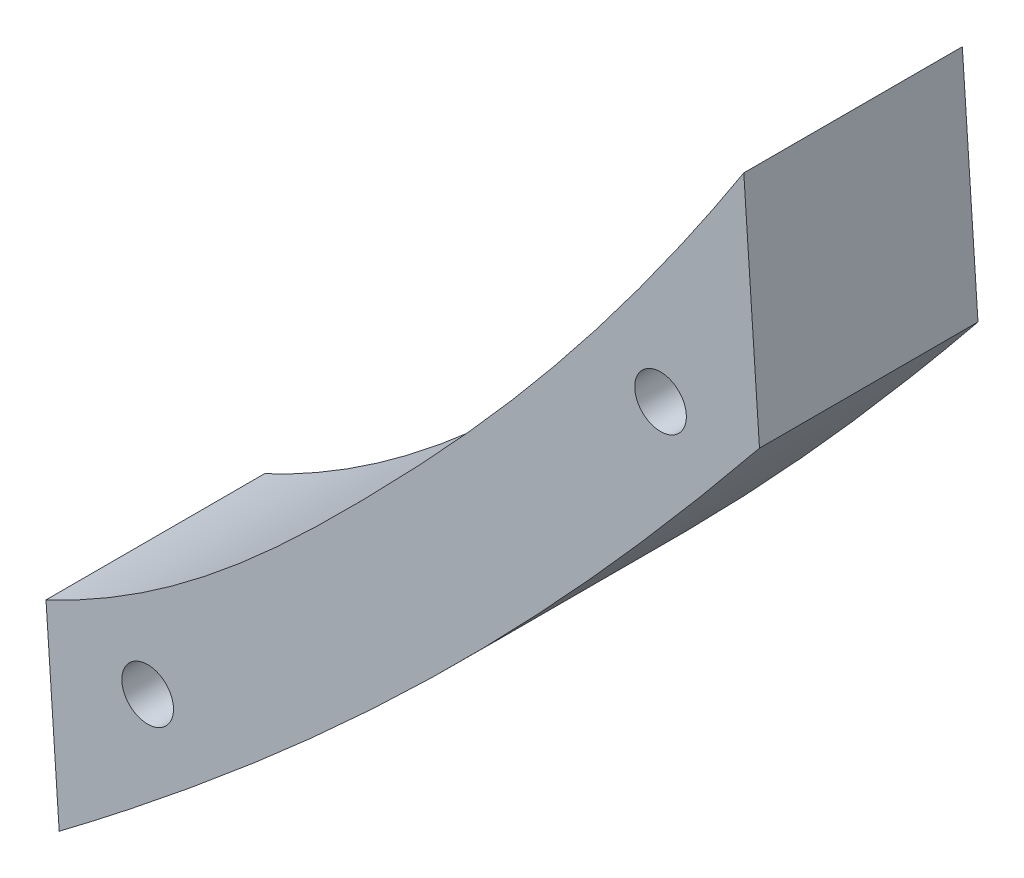
ISO-10303-21;
HEADER;
FILE_DESCRIPTION(('STEP AP214'),'2;1');
FILE_NAME('part.step','',(''),(''),'','','');
FILE_SCHEMA(('AUTOMOTIVE_DESIGN { 1 0 10303 214 1 1 1 1 }'));
ENDSEC;
DATA;
#1=APPLICATION_CONTEXT('core data for automotive mechanical design processes');
#2=APPLICATION_PROTOCOL_DEFINITION('international standard','automotive_design',2000,#1);
#3=PRODUCT_CONTEXT('',#1,'mechanical');
#4=PRODUCT('Part','Part','',(#3));
#5=PRODUCT_RELATED_PRODUCT_CATEGORY('part','',(#4));
#6=PRODUCT_DEFINITION_FORMATION('','',#4);
#7=PRODUCT_DEFINITION_CONTEXT('part definition',#1,'design');
#8=PRODUCT_DEFINITION('design','',#6,#7);
#9=PRODUCT_DEFINITION_SHAPE('','',#8);
#10=(LENGTH_UNIT() NAMED_UNIT(*) SI_UNIT(.MILLI.,.METRE.));
#11=(NAMED_UNIT(*) PLANE_ANGLE_UNIT() SI_UNIT($,.RADIAN.));
#12=(NAMED_UNIT(*) SI_UNIT($,.STERADIAN.) SOLID_ANGLE_UNIT());
#13=UNCERTAINTY_MEASURE_WITH_UNIT(LENGTH_MEASURE(1.E-05),#10,'distance_accuracy_value','');
#14=(GEOMETRIC_REPRESENTATION_CONTEXT(3) GLOBAL_UNCERTAINTY_ASSIGNED_CONTEXT((#13)) GLOBAL_UNIT_ASSIGNED_CONTEXT((#10,
#11,#12)) REPRESENTATION_CONTEXT('',''));
#15=CARTESIAN_POINT('',(0.,0.,0.));
#16=DIRECTION('',(0.,0.,1.));
#17=DIRECTION('',(1.,0.,0.));
#18=AXIS2_PLACEMENT_3D('',#15,#16,#17);
#19=CARTESIAN_POINT('',(25.2640248175677,1.7189432963557,22.));
#20=DIRECTION('',(0.99769334125609,0.0678822275213385,0.));
#21=DIRECTION('',(-0.0678822275213385,0.99769334125609,0.));
#22=AXIS2_PLACEMENT_3D('',#19,#20,#21);
#23=PLANE('',#22);
#24=DIRECTION('',(0.0678822275213385,-0.99769334125609,0.));
#25=VECTOR('',#24,1.);
#26=CARTESIAN_POINT('',(25.2640248175677,1.7189432963557,0.));
#27=LINE('',#26,#25);
#28=CARTESIAN_POINT('',(23.8473409387099,22.5405356955889,0.));
#29=VERTEX_POINT('',#28);
#30=CARTESIAN_POINT('',(25.4265953780617,-0.670423871038782,0.));
#31=VERTEX_POINT('',#30);
#32=EDGE_CURVE('E201',#29,#31,#27,.T.);
#33=ORIENTED_EDGE('',*,*,#32,.F.);
#34=DIRECTION('',(0.,0.,-1.));
#35=VECTOR('',#34,1.);
#36=CARTESIAN_POINT('',(23.8473409387099,22.5405356955889,22.));
#37=LINE('',#36,#35);
#38=CARTESIAN_POINT('',(23.8473409387099,22.5405356955889,22.));
#39=VERTEX_POINT('',#38);
#40=EDGE_CURVE('E11',#39,#29,#37,.T.);
#41=ORIENTED_EDGE('',*,*,#40,.F.);
#42=DIRECTION('',(0.0678822275213385,-0.99769334125609,0.));
#43=VECTOR('',#42,1.);
#44=CARTESIAN_POINT('',(25.2640248175677,1.7189432963557,22.));
#45=LINE('',#44,#43);
#46=CARTESIAN_POINT('',(25.4265953780617,-0.670423871038782,22.));
#47=VERTEX_POINT('',#46);
#48=EDGE_CURVE('E111',#39,#47,#45,.T.);
#49=ORIENTED_EDGE('',*,*,#48,.T.);
#50=DIRECTION('',(0.,0.,-1.));
#51=VECTOR('',#50,1.);
#52=CARTESIAN_POINT('',(25.4265953780617,-0.670423871038782,22.));
#53=LINE('',#52,#51);
#54=EDGE_CURVE('E91',#47,#31,#53,.T.);
#55=ORIENTED_EDGE('',*,*,#54,.T.);
#56=EDGE_LOOP('',(#33,#41,#49,#55));
#57=FACE_BOUND('',#56,.T.);
#58=ADVANCED_FACE('F45',(#57),#23,.T.);
#59=CARTESIAN_POINT('',(23.8473409387099,22.5405356955889,22.));
#60=CARTESIAN_POINT('',(23.6491535304646,22.2332919819376,22.));
#61=CARTESIAN_POINT('',(23.4504855713976,21.9263568846529,22.));
#62=CARTESIAN_POINT('',(19.3021932377396,15.5395771900557,22.));
#63=CARTESIAN_POINT('',(15.1597025894018,9.58517610056214,22.));
#64=CARTESIAN_POINT('',(8.59675494574103,0.91529588340617,22.));
#65=CARTESIAN_POINT('',(6.35133789966357,-1.93124749239646,22.));
#66=CARTESIAN_POINT('',(1.74462724827758,-7.52826665116865,22.));
#67=CARTESIAN_POINT('',(-0.617237974392294,-10.2791378985868,22.));
#68=CARTESIAN_POINT('',(-5.44585246443262,-15.6858887260502,22.));
#69=CARTESIAN_POINT('',(-7.91319599352471,-18.3424702154184,22.));
#70=CARTESIAN_POINT('',(-11.6749588076315,-22.2679797221105,22.));
#71=CARTESIAN_POINT('',(-12.9389825872912,-23.5670735030108,22.));
#72=CARTESIAN_POINT('',(-15.4831035950763,-26.1491048737287,22.));
#73=CARTESIAN_POINT('',(-16.7624451532667,-27.4327600415091,22.));
#74=CARTESIAN_POINT('',(-20.6400219649403,-31.2437417473805,22.));
#75=CARTESIAN_POINT('',(-23.2785774509376,-33.7322264411462,22.));
#76=CARTESIAN_POINT('',(-28.7493487435284,-38.4912441648454,22.));
#77=CARTESIAN_POINT('',(-31.5819329797457,-40.7614767858578,22.));
#78=CARTESIAN_POINT('',(-37.5021552599386,-44.94807953671,22.));
#79=CARTESIAN_POINT('',(-40.5908011413323,-46.8630063146389,22.));
#80=CARTESIAN_POINT('',(-44.6645701900234,-48.977283832471,22.));
#81=CARTESIAN_POINT('',(-45.5296321195015,-49.4039996667277,22.));
#82=CARTESIAN_POINT('',(-46.4032182060406,-49.8124954453141,22.));
#83=B_SPLINE_CURVE_WITH_KNOTS('',3,(#59,#60,#61,#62,#63,#64,#65,#66,#67,#68,#69,#70,#71,#72,#73,
#74,#75,#76,#77,#78,#79,#80,#81,#82),.UNSPECIFIED.,.F.,.F.,(4,2,2,2,2,2,2,2,2,2,2,4),
(0.243696274232532,0.25,0.375,0.4375,0.5,0.5625,0.59375,0.625,0.6875,0.75,0.8125,
0.829122532866038),.UNSPECIFIED.);
#84=DIRECTION('',(0.,0.,-1.));
#85=VECTOR('',#84,1.);
#86=SURFACE_OF_LINEAR_EXTRUSION('',#83,#85);
#87=CARTESIAN_POINT('',(23.8473409387099,22.5405356955889,0.));
#88=CARTESIAN_POINT('',(23.6491535304646,22.2332919819376,0.));
#89=CARTESIAN_POINT('',(23.4504855713976,21.9263568846529,0.));
#90=CARTESIAN_POINT('',(19.3021932377396,15.5395771900557,0.));
#91=CARTESIAN_POINT('',(15.1597025894018,9.58517610056214,0.));
#92=CARTESIAN_POINT('',(8.59675494574103,0.91529588340617,0.));
#93=CARTESIAN_POINT('',(6.35133789966357,-1.93124749239646,0.));
#94=CARTESIAN_POINT('',(1.74462724827758,-7.52826665116865,0.));
#95=CARTESIAN_POINT('',(-0.617237974392294,-10.2791378985868,0.));
#96=CARTESIAN_POINT('',(-5.44585246443262,-15.6858887260502,0.));
#97=CARTESIAN_POINT('',(-7.91319599352471,-18.3424702154184,0.));
#98=CARTESIAN_POINT('',(-11.6749588076315,-22.2679797221105,0.));
#99=CARTESIAN_POINT('',(-12.9389825872912,-23.5670735030108,0.));
#100=CARTESIAN_POINT('',(-15.4831035950763,-26.1491048737287,0.));
#101=CARTESIAN_POINT('',(-16.7624451532667,-27.4327600415091,0.));
#102=CARTESIAN_POINT('',(-20.6400219649403,-31.2437417473805,0.));
#103=CARTESIAN_POINT('',(-23.2785774509376,-33.7322264411462,0.));
#104=CARTESIAN_POINT('',(-28.7493487435284,-38.4912441648454,0.));
#105=CARTESIAN_POINT('',(-31.5819329797457,-40.7614767858578,0.));
#106=CARTESIAN_POINT('',(-37.5021552599386,-44.94807953671,0.));
#107=CARTESIAN_POINT('',(-40.5908011413323,-46.8630063146389,0.));
#108=CARTESIAN_POINT('',(-44.6645701900234,-48.977283832471,0.));
#109=CARTESIAN_POINT('',(-45.5296321195015,-49.4039996667277,0.));
#110=CARTESIAN_POINT('',(-46.4032182060406,-49.8124954453141,0.));
#111=B_SPLINE_CURVE_WITH_KNOTS('',3,(#87,#88,#89,#90,#91,#92,#93,#94,#95,#96,#97,#98,#99,#100,
#101,#102,#103,#104,#105,#106,#107,#108,#109,#110),.UNSPECIFIED.,.F.,.F.,(4,2,2,2,2,2,2,2,2,2,2,
4),(0.243696274232532,0.25,0.375,0.4375,0.5,0.5625,0.59375,0.625,0.6875,0.75,0.8125,
0.829122532866038),.UNSPECIFIED.);
#112=CARTESIAN_POINT('',(-46.4032182060407,-49.8124954453141,0.));
#113=VERTEX_POINT('',#112);
#114=EDGE_CURVE('E119',#29,#113,#111,.T.);
#115=ORIENTED_EDGE('',*,*,#114,.T.);
#116=DIRECTION('',(0.,0.,-1.));
#117=VECTOR('',#116,1.);
#118=CARTESIAN_POINT('',(-46.4032182060407,-49.8124954453141,22.));
#119=LINE('',#118,#117);
#120=CARTESIAN_POINT('',(-46.4032182060407,-49.8124954453141,22.));
#121=VERTEX_POINT('',#120);
#122=EDGE_CURVE('E58',#121,#113,#119,.T.);
#123=ORIENTED_EDGE('',*,*,#122,.F.);
#124=CARTESIAN_POINT('',(-46.4032182060406,-49.8124954453141,22.));
#125=CARTESIAN_POINT('',(-45.5296321195015,-49.4039996667277,22.));
#126=CARTESIAN_POINT('',(-44.6645701900234,-48.977283832471,22.));
#127=CARTESIAN_POINT('',(-40.5908011413323,-46.8630063146389,22.));
#128=CARTESIAN_POINT('',(-37.5021552599386,-44.94807953671,22.));
#129=CARTESIAN_POINT('',(-31.5819329797457,-40.7614767858578,22.));
#130=CARTESIAN_POINT('',(-28.7493487435284,-38.4912441648454,22.));
#131=CARTESIAN_POINT('',(-23.2785774509376,-33.7322264411462,22.));
#132=CARTESIAN_POINT('',(-20.6400219649403,-31.2437417473805,22.));
#133=CARTESIAN_POINT('',(-16.7624451532667,-27.4327600415091,22.));
#134=CARTESIAN_POINT('',(-15.4831035950763,-26.1491048737287,22.));
#135=CARTESIAN_POINT('',(-12.9389825872912,-23.5670735030108,22.));
#136=CARTESIAN_POINT('',(-11.6749588076315,-22.2679797221105,22.));
#137=CARTESIAN_POINT('',(-7.91319599352471,-18.3424702154184,22.));
#138=CARTESIAN_POINT('',(-5.44585246443262,-15.6858887260502,22.));
#139=CARTESIAN_POINT('',(-0.617237974392294,-10.2791378985868,22.));
#140=CARTESIAN_POINT('',(1.74462724827758,-7.52826665116865,22.));
#141=CARTESIAN_POINT('',(6.35133789966357,-1.93124749239646,22.));
#142=CARTESIAN_POINT('',(8.59675494574103,0.91529588340617,22.));
#143=CARTESIAN_POINT('',(15.1597025894018,9.58517610056214,22.));
#144=CARTESIAN_POINT('',(19.3021932377396,15.5395771900557,22.));
#145=CARTESIAN_POINT('',(23.4504855713976,21.9263568846529,22.));
#146=CARTESIAN_POINT('',(23.6491535304646,22.2332919819376,22.));
#147=CARTESIAN_POINT('',(23.8473409387099,22.5405356955889,22.));
#148=B_SPLINE_CURVE_WITH_KNOTS('',3,(#124,#125,#126,#127,#128,#129,#130,#131,#132,#133,#134,
#135,#136,#137,#138,#139,#140,#141,#142,#143,#144,#145,#146,#147),.UNSPECIFIED.,.F.,.F.,(4,2,2,
2,2,2,2,2,2,2,2,4),(0.243696274232532,0.26031880709857,0.32281880709857,0.38531880709857,
0.44781880709857,0.47906880709857,0.51031880709857,0.57281880709857,0.63531880709857,
0.69781880709857,0.82281880709857,0.829122532866038),.UNSPECIFIED.);
#149=EDGE_CURVE('E107',#39,#121,#148,.F.);
#150=ORIENTED_EDGE('',*,*,#149,.F.);
#151=ORIENTED_EDGE('',*,*,#40,.T.);
#152=EDGE_LOOP('',(#115,#123,#150,#151));
#153=FACE_BOUND('',#152,.T.);
#154=ADVANCED_FACE('F117',(#153),#86,.F.);
#155=CARTESIAN_POINT('',(-49.5629757766391,-3.37222376774472,22.));
#156=DIRECTION('',(0.99769334125609,0.0678822275213391,0.));
#157=DIRECTION('',(-0.0678822275213391,0.99769334125609,0.));
#158=AXIS2_PLACEMENT_3D('',#155,#156,#157);
#159=PLANE('',#158);
#160=DIRECTION('',(0.0678822275213391,-0.99769334125609,0.));
#161=VECTOR('',#160,1.);
#162=CARTESIAN_POINT('',(-49.5629757766391,-3.37222376774472,0.));
#163=LINE('',#162,#161);
#164=CARTESIAN_POINT('',(-45.0755582048845,-69.3256668743038,0.));
#165=VERTEX_POINT('',#164);
#166=EDGE_CURVE('E191',#113,#165,#163,.T.);
#167=ORIENTED_EDGE('',*,*,#166,.T.);
#168=DIRECTION('',(0.,0.,-1.));
#169=VECTOR('',#168,1.);
#170=CARTESIAN_POINT('',(-45.0755582048845,-69.3256668743038,22.));
#171=LINE('',#170,#169);
#172=CARTESIAN_POINT('',(-45.0755582048845,-69.3256668743038,22.));
#173=VERTEX_POINT('',#172);
#174=EDGE_CURVE('E105',#173,#165,#171,.T.);
#175=ORIENTED_EDGE('',*,*,#174,.F.);
#176=DIRECTION('',(0.0678822275213391,-0.99769334125609,0.));
#177=VECTOR('',#176,1.);
#178=CARTESIAN_POINT('',(-49.5629757766391,-3.37222376774472,22.));
#179=LINE('',#178,#177);
#180=EDGE_CURVE('E99',#121,#173,#179,.T.);
#181=ORIENTED_EDGE('',*,*,#180,.F.);
#182=ORIENTED_EDGE('',*,*,#122,.T.);
#183=EDGE_LOOP('',(#167,#175,#181,#182));
#184=FACE_BOUND('',#183,.T.);
#185=ADVANCED_FACE('F102',(#184),#159,.F.);
#186=CARTESIAN_POINT('',(15.4665953780617,-1.598123556049,22.));
#187=DIRECTION('',(0.,0.,-1.));
#188=DIRECTION('',(-1.,0.,0.));
#189=AXIS2_PLACEMENT_3D('',#186,#187,#188);
#190=CYLINDRICAL_SURFACE('',#189,2.6);
#191=CARTESIAN_POINT('',(15.4665953780617,-1.598123556049,22.));
#192=DIRECTION('',(0.,0.,1.));
#193=DIRECTION('',(1.,0.,0.));
#194=AXIS2_PLACEMENT_3D('',#191,#192,#193);
#195=CIRCLE('',#194,2.6);
#196=CARTESIAN_POINT('',(18.0665953780617,-1.598123556049,22.));
#197=VERTEX_POINT('',#196);
#198=EDGE_CURVE('E151',#197,#197,#195,.T.);
#199=ORIENTED_EDGE('',*,*,#198,.T.);
#200=EDGE_LOOP('',(#199));
#201=FACE_BOUND('',#200,.T.);
#202=CARTESIAN_POINT('',(15.4665953780617,-1.598123556049,0.));
#203=DIRECTION('',(0.,0.,1.));
#204=DIRECTION('',(1.,0.,0.));
#205=AXIS2_PLACEMENT_3D('',#202,#203,#204);
#206=CIRCLE('',#205,2.6);
#207=CARTESIAN_POINT('',(18.0665953780617,-1.598123556049,0.));
#208=VERTEX_POINT('',#207);
#209=EDGE_CURVE('E203',#208,#208,#206,.T.);
#210=ORIENTED_EDGE('',*,*,#209,.F.);
#211=EDGE_LOOP('',(#210));
#212=FACE_BOUND('',#211,.T.);
#213=ADVANCED_FACE('F257',(#201,#212),#190,.F.);
#214=CARTESIAN_POINT('',(-36.1678861212229,-52.9314659667362,22.));
#215=DIRECTION('',(0.,0.,-1.));
#216=DIRECTION('',(-1.,0.,0.));
#217=AXIS2_PLACEMENT_3D('',#214,#215,#216);
#218=CYLINDRICAL_SURFACE('',#217,2.59999999986289);
#219=CARTESIAN_POINT('',(-36.1678861212229,-52.9314659667362,22.));
#220=DIRECTION('',(0.,0.,1.));
#221=DIRECTION('',(1.,0.,0.));
#222=AXIS2_PLACEMENT_3D('',#219,#220,#221);
#223=CIRCLE('',#222,2.59999999986289);
#224=CARTESIAN_POINT('',(-33.56788612136,-52.9314659667362,22.));
#225=VERTEX_POINT('',#224);
#226=EDGE_CURVE('E315',#225,#225,#223,.T.);
#227=ORIENTED_EDGE('',*,*,#226,.T.);
#228=EDGE_LOOP('',(#227));
#229=FACE_BOUND('',#228,.T.);
#230=CARTESIAN_POINT('',(-36.1678861212229,-52.9314659667362,0.));
#231=DIRECTION('',(0.,0.,1.));
#232=DIRECTION('',(1.,0.,0.));
#233=AXIS2_PLACEMENT_3D('',#230,#231,#232);
#234=CIRCLE('',#233,2.59999999986289);
#235=CARTESIAN_POINT('',(-33.56788612136,-52.9314659667362,0.));
#236=VERTEX_POINT('',#235);
#237=EDGE_CURVE('E160',#236,#236,#234,.T.);
#238=ORIENTED_EDGE('',*,*,#237,.F.);
#239=EDGE_LOOP('',(#238));
#240=FACE_BOUND('',#239,.T.);
#241=ADVANCED_FACE('F47',(#229,#240),#218,.F.);
#242=CARTESIAN_POINT('',(-45.0755582048845,-69.3256668743038,22.));
#243=CARTESIAN_POINT('',(-42.7543088320265,-67.5744162126505,22.));
#244=CARTESIAN_POINT('',(-40.4516692821754,-65.7985125405873,22.));
#245=CARTESIAN_POINT('',(-32.2943092341557,-59.3684686151079,22.));
#246=CARTESIAN_POINT('',(-26.5461000074045,-54.5782551081632,22.));
#247=CARTESIAN_POINT('',(-15.3451361817294,-44.6640211170277,22.));
#248=CARTESIAN_POINT('',(-9.89564699636274,-39.5366024868595,22.));
#249=CARTESIAN_POINT('',(0.681335287035538,-28.9590933895541,22.));
#250=CARTESIAN_POINT('',(5.80823644696768,-23.5095754280478,22.));
#251=CARTESIAN_POINT('',(15.7635037092364,-12.3443688121849,22.));
#252=CARTESIAN_POINT('',(20.5923466292677,-6.63073098368548,22.));
#253=CARTESIAN_POINT('',(25.3447026662408,-0.771444988781816,22.));
#254=CARTESIAN_POINT('',(25.3856534133577,-0.720937958902679,22.));
#255=CARTESIAN_POINT('',(25.4265953780617,-0.670423871038731,22.));
#256=B_SPLINE_CURVE_WITH_KNOTS('',3,(#242,#243,#244,#245,#246,#247,#248,#249,#250,#251,#252,
#253,#254,#255),.UNSPECIFIED.,.F.,.F.,(4,2,2,2,2,2,4),(0.201401882450051,0.25,0.375,0.5,0.625,
0.75,0.751086714791508),.UNSPECIFIED.);
#257=DIRECTION('',(0.,0.,-1.));
#258=VECTOR('',#257,1.);
#259=SURFACE_OF_LINEAR_EXTRUSION('',#256,#258);
#260=CARTESIAN_POINT('',(-45.0755582048845,-69.3256668743038,0.));
#261=CARTESIAN_POINT('',(-42.7543088320265,-67.5744162126505,0.));
#262=CARTESIAN_POINT('',(-40.4516692821754,-65.7985125405873,0.));
#263=CARTESIAN_POINT('',(-32.2943092341557,-59.3684686151079,0.));
#264=CARTESIAN_POINT('',(-26.5461000074045,-54.5782551081632,0.));
#265=CARTESIAN_POINT('',(-15.3451361817294,-44.6640211170277,0.));
#266=CARTESIAN_POINT('',(-9.89564699636274,-39.5366024868595,0.));
#267=CARTESIAN_POINT('',(0.681335287035538,-28.9590933895541,0.));
#268=CARTESIAN_POINT('',(5.80823644696768,-23.5095754280478,0.));
#269=CARTESIAN_POINT('',(15.7635037092364,-12.3443688121849,0.));
#270=CARTESIAN_POINT('',(20.5923466292677,-6.63073098368548,0.));
#271=CARTESIAN_POINT('',(25.3447026662408,-0.771444988781816,0.));
#272=CARTESIAN_POINT('',(25.3856534133577,-0.720937958902679,0.));
#273=CARTESIAN_POINT('',(25.4265953780617,-0.670423871038731,0.));
#274=B_SPLINE_CURVE_WITH_KNOTS('',3,(#260,#261,#262,#263,#264,#265,#266,#267,#268,#269,#270,
#271,#272,#273),.UNSPECIFIED.,.F.,.F.,(4,2,2,2,2,2,4),(0.201401882450051,0.25,0.375,0.5,0.625,
0.75,0.751086714791508),.UNSPECIFIED.);
#275=EDGE_CURVE('E83',#165,#31,#274,.T.);
#276=ORIENTED_EDGE('',*,*,#275,.T.);
#277=ORIENTED_EDGE('',*,*,#54,.F.);
#278=CARTESIAN_POINT('',(25.4265953780617,-0.670423871038731,22.));
#279=CARTESIAN_POINT('',(25.3856534133577,-0.720937958902679,22.));
#280=CARTESIAN_POINT('',(25.3447026662408,-0.771444988781816,22.));
#281=CARTESIAN_POINT('',(20.5923466292677,-6.63073098368548,22.));
#282=CARTESIAN_POINT('',(15.7635037092364,-12.3443688121849,22.));
#283=CARTESIAN_POINT('',(5.80823644696768,-23.5095754280478,22.));
#284=CARTESIAN_POINT('',(0.681335287035538,-28.9590933895541,22.));
#285=CARTESIAN_POINT('',(-9.89564699636274,-39.5366024868595,22.));
#286=CARTESIAN_POINT('',(-15.3451361817294,-44.6640211170277,22.));
#287=CARTESIAN_POINT('',(-26.5461000074045,-54.5782551081632,22.));
#288=CARTESIAN_POINT('',(-32.2943092341557,-59.3684686151079,22.));
#289=CARTESIAN_POINT('',(-40.4516692821754,-65.7985125405873,22.));
#290=CARTESIAN_POINT('',(-42.7543088320265,-67.5744162126505,22.));
#291=CARTESIAN_POINT('',(-45.0755582048845,-69.3256668743038,22.));
#292=B_SPLINE_CURVE_WITH_KNOTS('',3,(#278,#279,#280,#281,#282,#283,#284,#285,#286,#287,#288,
#289,#290,#291),.UNSPECIFIED.,.F.,.F.,(4,2,2,2,2,2,4),(0.201401882450051,0.202488597241559,
0.327488597241559,0.452488597241559,0.577488597241559,0.702488597241559,0.751086714791508),.UNSPECIFIED.);
#293=EDGE_CURVE('E67',#173,#47,#292,.F.);
#294=ORIENTED_EDGE('',*,*,#293,.F.);
#295=ORIENTED_EDGE('',*,*,#174,.T.);
#296=EDGE_LOOP('',(#276,#277,#294,#295));
#297=FACE_BOUND('',#296,.T.);
#298=ADVANCED_FACE('F165',(#297),#259,.F.);
#299=CARTESIAN_POINT('',(0.,0.,22.));
#300=DIRECTION('',(0.,0.,1.));
#301=DIRECTION('',(1.,0.,0.));
#302=AXIS2_PLACEMENT_3D('',#299,#300,#301);
#303=PLANE('',#302);
#304=ORIENTED_EDGE('',*,*,#226,.F.);
#305=EDGE_LOOP('',(#304));
#306=FACE_BOUND('',#305,.T.);
#307=ORIENTED_EDGE('',*,*,#198,.F.);
#308=EDGE_LOOP('',(#307));
#309=FACE_BOUND('',#308,.T.);
#310=ORIENTED_EDGE('',*,*,#48,.F.);
#311=ORIENTED_EDGE('',*,*,#149,.T.);
#312=ORIENTED_EDGE('',*,*,#180,.T.);
#313=ORIENTED_EDGE('',*,*,#293,.T.);
#314=EDGE_LOOP('',(#310,#311,#312,#313));
#315=FACE_BOUND('',#314,.T.);
#316=ADVANCED_FACE('F110',(#306,#309,#315),#303,.T.);
#317=CARTESIAN_POINT('',(0.,0.,0.));
#318=DIRECTION('',(0.,0.,1.));
#319=DIRECTION('',(1.,0.,0.));
#320=AXIS2_PLACEMENT_3D('',#317,#318,#319);
#321=PLANE('',#320);
#322=ORIENTED_EDGE('',*,*,#237,.T.);
#323=EDGE_LOOP('',(#322));
#324=FACE_BOUND('',#323,.T.);
#325=ORIENTED_EDGE('',*,*,#209,.T.);
#326=EDGE_LOOP('',(#325));
#327=FACE_BOUND('',#326,.T.);
#328=ORIENTED_EDGE('',*,*,#32,.T.);
#329=ORIENTED_EDGE('',*,*,#275,.F.);
#330=ORIENTED_EDGE('',*,*,#166,.F.);
#331=ORIENTED_EDGE('',*,*,#114,.F.);
#332=EDGE_LOOP('',(#328,#329,#330,#331));
#333=FACE_BOUND('',#332,.T.);
#334=ADVANCED_FACE('F169',(#324,#327,#333),#321,.F.);
#335=CLOSED_SHELL('',(#58,#154,#185,#213,#241,#298,#316,#334));
#336=MANIFOLD_SOLID_BREP('B2',#335);
#337=ADVANCED_BREP_SHAPE_REPRESENTATION('',(#18,#336),#14);
#338=SHAPE_DEFINITION_REPRESENTATION(#9,#337);
ENDSEC;
END-ISO-10303-21;
